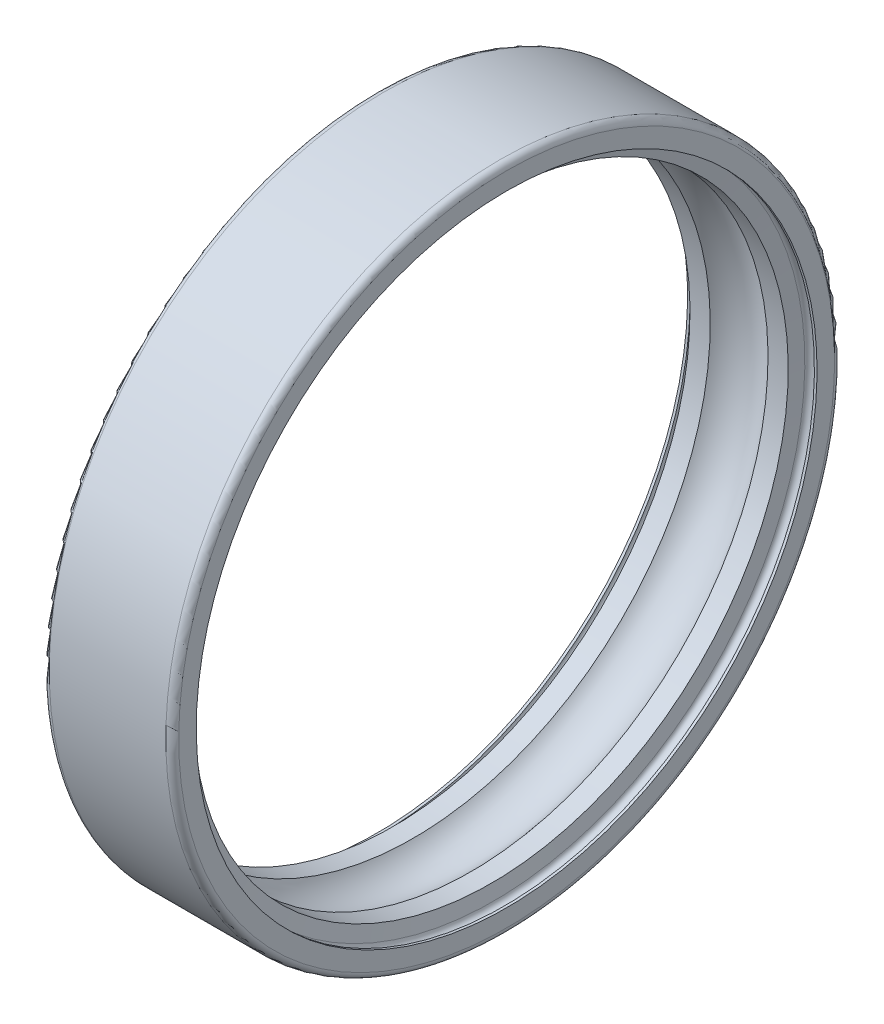
ISO-10303-21;
HEADER;
FILE_DESCRIPTION(('STEP AP214'),'2;1');
FILE_NAME('part.step','',(''),(''),'','','');
FILE_SCHEMA(('AUTOMOTIVE_DESIGN { 1 0 10303 214 1 1 1 1 }'));
ENDSEC;
DATA;
#1=APPLICATION_CONTEXT('core data for automotive mechanical design processes');
#2=APPLICATION_PROTOCOL_DEFINITION('international standard','automotive_design',2000,#1);
#3=PRODUCT_CONTEXT('',#1,'mechanical');
#4=PRODUCT('Part','Part','',(#3));
#5=PRODUCT_RELATED_PRODUCT_CATEGORY('part','',(#4));
#6=PRODUCT_DEFINITION_FORMATION('','',#4);
#7=PRODUCT_DEFINITION_CONTEXT('part definition',#1,'design');
#8=PRODUCT_DEFINITION('design','',#6,#7);
#9=PRODUCT_DEFINITION_SHAPE('','',#8);
#10=(LENGTH_UNIT() NAMED_UNIT(*) SI_UNIT(.MILLI.,.METRE.));
#11=(NAMED_UNIT(*) PLANE_ANGLE_UNIT() SI_UNIT($,.RADIAN.));
#12=(NAMED_UNIT(*) SI_UNIT($,.STERADIAN.) SOLID_ANGLE_UNIT());
#13=UNCERTAINTY_MEASURE_WITH_UNIT(LENGTH_MEASURE(1.E-05),#10,'distance_accuracy_value','');
#14=(GEOMETRIC_REPRESENTATION_CONTEXT(3) GLOBAL_UNCERTAINTY_ASSIGNED_CONTEXT((#13)) GLOBAL_UNIT_ASSIGNED_CONTEXT((#10,
#11,#12)) REPRESENTATION_CONTEXT('',''));
#15=CARTESIAN_POINT('',(0.,0.,0.));
#16=DIRECTION('',(0.,0.,1.));
#17=DIRECTION('',(1.,0.,0.));
#18=AXIS2_PLACEMENT_3D('',#15,#16,#17);
#19=CARTESIAN_POINT('',(11.265,0.,0.));
#20=DIRECTION('',(1.,0.,0.));
#21=DIRECTION('',(0.,0.,-1.));
#22=AXIS2_PLACEMENT_3D('',#19,#20,#21);
#23=TOROIDAL_SURFACE('',#22,28.775,0.49);
#24=CARTESIAN_POINT('',(11.755,0.,0.));
#25=DIRECTION('',(1.,0.,0.));
#26=DIRECTION('',(0.,1.,0.));
#27=AXIS2_PLACEMENT_3D('',#24,#25,#26);
#28=CIRCLE('',#27,28.775);
#29=CARTESIAN_POINT('',(11.755,28.775,0.));
#30=VERTEX_POINT('',#29);
#31=EDGE_CURVE('E11',#30,#30,#28,.T.);
#32=ORIENTED_EDGE('',*,*,#31,.T.);
#33=EDGE_LOOP('',(#32));
#34=FACE_BOUND('',#33,.T.);
#35=CARTESIAN_POINT('',(10.782444201024,0.,0.));
#36=DIRECTION('',(1.,0.,0.));
#37=DIRECTION('',(0.,1.,0.));
#38=AXIS2_PLACEMENT_3D('',#35,#36,#37);
#39=CIRCLE('',#38,28.8600876070568);
#40=CARTESIAN_POINT('',(10.782444201024,28.8600876070568,0.));
#41=VERTEX_POINT('',#40);
#42=EDGE_CURVE('E90',#41,#41,#39,.T.);
#43=ORIENTED_EDGE('',*,*,#42,.F.);
#44=EDGE_LOOP('',(#43));
#45=FACE_BOUND('',#44,.T.);
#46=ADVANCED_FACE('F16',(#34,#45),#23,.F.);
#47=CARTESIAN_POINT('',(11.8775,0.,0.));
#48=DIRECTION('',(-1.,0.,0.));
#49=DIRECTION('',(0.,1.,0.));
#50=AXIS2_PLACEMENT_3D('',#47,#48,#49);
#51=CYLINDRICAL_SURFACE('',#50,28.775);
#52=CARTESIAN_POINT('',(12.,0.,0.));
#53=DIRECTION('',(1.,0.,0.));
#54=DIRECTION('',(0.,1.,0.));
#55=AXIS2_PLACEMENT_3D('',#52,#53,#54);
#56=CIRCLE('',#55,28.775);
#57=CARTESIAN_POINT('',(12.,28.775,0.));
#58=VERTEX_POINT('',#57);
#59=EDGE_CURVE('E26',#58,#58,#56,.T.);
#60=ORIENTED_EDGE('',*,*,#59,.T.);
#61=EDGE_LOOP('',(#60));
#62=FACE_BOUND('',#61,.T.);
#63=ORIENTED_EDGE('',*,*,#31,.F.);
#64=EDGE_LOOP('',(#63));
#65=FACE_BOUND('',#64,.T.);
#66=ADVANCED_FACE('F123',(#62,#65),#51,.F.);
#67=CARTESIAN_POINT('',(12.,29.5875,0.));
#68=DIRECTION('',(1.,0.,0.));
#69=DIRECTION('',(0.,1.,0.));
#70=AXIS2_PLACEMENT_3D('',#67,#68,#69);
#71=PLANE('',#70);
#72=CARTESIAN_POINT('',(12.,0.,0.));
#73=DIRECTION('',(1.,0.,0.));
#74=DIRECTION('',(0.,1.,0.));
#75=AXIS2_PLACEMENT_3D('',#72,#73,#74);
#76=CIRCLE('',#75,30.4);
#77=CARTESIAN_POINT('',(12.,30.4,0.));
#78=VERTEX_POINT('',#77);
#79=EDGE_CURVE('E77',#78,#78,#76,.T.);
#80=ORIENTED_EDGE('',*,*,#79,.T.);
#81=EDGE_LOOP('',(#80));
#82=FACE_BOUND('',#81,.T.);
#83=ORIENTED_EDGE('',*,*,#59,.F.);
#84=EDGE_LOOP('',(#83));
#85=FACE_BOUND('',#84,.T.);
#86=ADVANCED_FACE('F128',(#82,#85),#71,.T.);
#87=CARTESIAN_POINT('',(11.4,0.,0.));
#88=DIRECTION('',(1.,0.,0.));
#89=DIRECTION('',(0.,0.,-1.));
#90=AXIS2_PLACEMENT_3D('',#87,#88,#89);
#91=TOROIDAL_SURFACE('',#90,30.4,0.6);
#92=CARTESIAN_POINT('',(11.4,0.,0.));
#93=DIRECTION('',(1.,0.,0.));
#94=DIRECTION('',(0.,1.,0.));
#95=AXIS2_PLACEMENT_3D('',#92,#93,#94);
#96=CIRCLE('',#95,31.);
#97=CARTESIAN_POINT('',(11.4,31.,0.));
#98=VERTEX_POINT('',#97);
#99=EDGE_CURVE('E73',#98,#98,#96,.T.);
#100=ORIENTED_EDGE('',*,*,#99,.T.);
#101=EDGE_LOOP('',(#100));
#102=FACE_BOUND('',#101,.T.);
#103=ORIENTED_EDGE('',*,*,#79,.F.);
#104=EDGE_LOOP('',(#103));
#105=FACE_BOUND('',#104,.T.);
#106=ADVANCED_FACE('F74',(#102,#105),#91,.T.);
#107=CARTESIAN_POINT('',(6.,0.,0.));
#108=DIRECTION('',(-1.,0.,0.));
#109=DIRECTION('',(0.,1.,0.));
#110=AXIS2_PLACEMENT_3D('',#107,#108,#109);
#111=CYLINDRICAL_SURFACE('',#110,31.);
#112=CARTESIAN_POINT('',(0.6,0.,0.));
#113=DIRECTION('',(1.,0.,0.));
#114=DIRECTION('',(0.,1.,0.));
#115=AXIS2_PLACEMENT_3D('',#112,#113,#114);
#116=CIRCLE('',#115,31.);
#117=CARTESIAN_POINT('',(0.6,31.,0.));
#118=VERTEX_POINT('',#117);
#119=EDGE_CURVE('E78',#118,#118,#116,.T.);
#120=ORIENTED_EDGE('',*,*,#119,.T.);
#121=EDGE_LOOP('',(#120));
#122=FACE_BOUND('',#121,.T.);
#123=ORIENTED_EDGE('',*,*,#99,.F.);
#124=EDGE_LOOP('',(#123));
#125=FACE_BOUND('',#124,.T.);
#126=ADVANCED_FACE('F134',(#122,#125),#111,.T.);
#127=CARTESIAN_POINT('',(0.6,0.,0.));
#128=DIRECTION('',(1.,0.,0.));
#129=DIRECTION('',(0.,0.,-1.));
#130=AXIS2_PLACEMENT_3D('',#127,#128,#129);
#131=TOROIDAL_SURFACE('',#130,30.4,0.6);
#132=CARTESIAN_POINT('',(0.,0.,0.));
#133=DIRECTION('',(1.,0.,0.));
#134=DIRECTION('',(0.,1.,0.));
#135=AXIS2_PLACEMENT_3D('',#132,#133,#134);
#136=CIRCLE('',#135,30.4);
#137=CARTESIAN_POINT('',(0.,30.4,0.));
#138=VERTEX_POINT('',#137);
#139=EDGE_CURVE('E81',#138,#138,#136,.T.);
#140=ORIENTED_EDGE('',*,*,#139,.T.);
#141=EDGE_LOOP('',(#140));
#142=FACE_BOUND('',#141,.T.);
#143=ORIENTED_EDGE('',*,*,#119,.F.);
#144=EDGE_LOOP('',(#143));
#145=FACE_BOUND('',#144,.T.);
#146=ADVANCED_FACE('F204',(#142,#145),#131,.T.);
#147=CARTESIAN_POINT('',(0.,29.5875,0.));
#148=DIRECTION('',(-1.,0.,0.));
#149=DIRECTION('',(0.,-1.,0.));
#150=AXIS2_PLACEMENT_3D('',#147,#148,#149);
#151=PLANE('',#150);
#152=CARTESIAN_POINT('',(0.,0.,0.));
#153=DIRECTION('',(1.,0.,0.));
#154=DIRECTION('',(0.,1.,0.));
#155=AXIS2_PLACEMENT_3D('',#152,#153,#154);
#156=CIRCLE('',#155,28.775);
#157=CARTESIAN_POINT('',(0.,28.775,0.));
#158=VERTEX_POINT('',#157);
#159=EDGE_CURVE('E52',#158,#158,#156,.T.);
#160=ORIENTED_EDGE('',*,*,#159,.T.);
#161=EDGE_LOOP('',(#160));
#162=FACE_BOUND('',#161,.T.);
#163=ORIENTED_EDGE('',*,*,#139,.F.);
#164=EDGE_LOOP('',(#163));
#165=FACE_BOUND('',#164,.T.);
#166=ADVANCED_FACE('F18',(#162,#165),#151,.T.);
#167=CARTESIAN_POINT('',(0.122499999999999,0.,0.));
#168=DIRECTION('',(-1.,0.,0.));
#169=DIRECTION('',(0.,1.,0.));
#170=AXIS2_PLACEMENT_3D('',#167,#168,#169);
#171=CYLINDRICAL_SURFACE('',#170,28.775);
#172=CARTESIAN_POINT('',(0.245,0.,0.));
#173=DIRECTION('',(1.,0.,0.));
#174=DIRECTION('',(0.,1.,0.));
#175=AXIS2_PLACEMENT_3D('',#172,#173,#174);
#176=CIRCLE('',#175,28.775);
#177=CARTESIAN_POINT('',(0.245,28.775,0.));
#178=VERTEX_POINT('',#177);
#179=EDGE_CURVE('E60',#178,#178,#176,.T.);
#180=ORIENTED_EDGE('',*,*,#179,.T.);
#181=EDGE_LOOP('',(#180));
#182=FACE_BOUND('',#181,.T.);
#183=ORIENTED_EDGE('',*,*,#159,.F.);
#184=EDGE_LOOP('',(#183));
#185=FACE_BOUND('',#184,.T.);
#186=ADVANCED_FACE('F118',(#182,#185),#171,.F.);
#187=CARTESIAN_POINT('',(0.735,0.,0.));
#188=DIRECTION('',(1.,0.,0.));
#189=DIRECTION('',(0.,0.,-1.));
#190=AXIS2_PLACEMENT_3D('',#187,#188,#189);
#191=TOROIDAL_SURFACE('',#190,28.775,0.49);
#192=CARTESIAN_POINT('',(1.21755579897598,0.,0.));
#193=DIRECTION('',(1.,0.,0.));
#194=DIRECTION('',(0.,1.,0.));
#195=AXIS2_PLACEMENT_3D('',#192,#193,#194);
#196=CIRCLE('',#195,28.8600876070568);
#197=CARTESIAN_POINT('',(1.21755579897598,28.8600876070568,0.));
#198=VERTEX_POINT('',#197);
#199=EDGE_CURVE('E87',#198,#198,#196,.T.);
#200=ORIENTED_EDGE('',*,*,#199,.T.);
#201=EDGE_LOOP('',(#200));
#202=FACE_BOUND('',#201,.T.);
#203=ORIENTED_EDGE('',*,*,#179,.F.);
#204=EDGE_LOOP('',(#203));
#205=FACE_BOUND('',#204,.T.);
#206=ADVANCED_FACE('F102',(#202,#205),#191,.F.);
#207=CARTESIAN_POINT('',(1.33305769508393,0.,0.));
#208=DIRECTION('',(-1.,0.,0.));
#209=DIRECTION('',(0.,1.,0.));
#210=AXIS2_PLACEMENT_3D('',#207,#208,#209);
#211=CONICAL_SURFACE('',#210,28.2050438035284,1.39626340159546);
#212=CARTESIAN_POINT('',(1.44855959119188,0.,0.));
#213=DIRECTION('',(1.,0.,0.));
#214=DIRECTION('',(0.,1.,0.));
#215=AXIS2_PLACEMENT_3D('',#212,#213,#214);
#216=CIRCLE('',#215,27.55);
#217=CARTESIAN_POINT('',(1.44855959119188,27.55,0.));
#218=VERTEX_POINT('',#217);
#219=EDGE_CURVE('E93',#218,#218,#216,.T.);
#220=ORIENTED_EDGE('',*,*,#219,.T.);
#221=EDGE_LOOP('',(#220));
#222=FACE_BOUND('',#221,.T.);
#223=ORIENTED_EDGE('',*,*,#199,.F.);
#224=EDGE_LOOP('',(#223));
#225=FACE_BOUND('',#224,.T.);
#226=ADVANCED_FACE('F105',(#222,#225),#211,.F.);
#227=CARTESIAN_POINT('',(2.384690096285,0.,0.));
#228=DIRECTION('',(-1.,0.,0.));
#229=DIRECTION('',(0.,1.,0.));
#230=AXIS2_PLACEMENT_3D('',#227,#228,#229);
#231=CYLINDRICAL_SURFACE('',#230,27.55);
#232=CARTESIAN_POINT('',(3.32082060137811,0.,0.));
#233=DIRECTION('',(1.,0.,0.));
#234=DIRECTION('',(0.,1.,0.));
#235=AXIS2_PLACEMENT_3D('',#232,#233,#234);
#236=CIRCLE('',#235,27.55);
#237=CARTESIAN_POINT('',(3.32082060137811,27.55,0.));
#238=VERTEX_POINT('',#237);
#239=EDGE_CURVE('E95',#238,#238,#236,.T.);
#240=ORIENTED_EDGE('',*,*,#239,.T.);
#241=EDGE_LOOP('',(#240));
#242=FACE_BOUND('',#241,.T.);
#243=ORIENTED_EDGE('',*,*,#219,.F.);
#244=EDGE_LOOP('',(#243));
#245=FACE_BOUND('',#244,.T.);
#246=ADVANCED_FACE('F107',(#242,#245),#231,.F.);
#247=CARTESIAN_POINT('',(6.,0.,0.));
#248=DIRECTION('',(1.,0.,0.));
#249=DIRECTION('',(0.,0.,-1.));
#250=AXIS2_PLACEMENT_3D('',#247,#248,#249);
#251=TOROIDAL_SURFACE('',#250,25.5,3.3735);
#252=CARTESIAN_POINT('',(8.67917939862189,0.,0.));
#253=DIRECTION('',(1.,0.,0.));
#254=DIRECTION('',(0.,1.,0.));
#255=AXIS2_PLACEMENT_3D('',#252,#253,#254);
#256=CIRCLE('',#255,27.55);
#257=CARTESIAN_POINT('',(8.67917939862189,27.55,0.));
#258=VERTEX_POINT('',#257);
#259=EDGE_CURVE('E91',#258,#258,#256,.T.);
#260=ORIENTED_EDGE('',*,*,#259,.T.);
#261=EDGE_LOOP('',(#260));
#262=FACE_BOUND('',#261,.T.);
#263=ORIENTED_EDGE('',*,*,#239,.F.);
#264=EDGE_LOOP('',(#263));
#265=FACE_BOUND('',#264,.T.);
#266=ADVANCED_FACE('F115',(#262,#265),#251,.F.);
#267=CARTESIAN_POINT('',(9.615309903715,0.,0.));
#268=DIRECTION('',(-1.,0.,0.));
#269=DIRECTION('',(0.,1.,0.));
#270=AXIS2_PLACEMENT_3D('',#267,#268,#269);
#271=CYLINDRICAL_SURFACE('',#270,27.55);
#272=CARTESIAN_POINT('',(10.5514404088081,0.,0.));
#273=DIRECTION('',(1.,0.,0.));
#274=DIRECTION('',(0.,1.,0.));
#275=AXIS2_PLACEMENT_3D('',#272,#273,#274);
#276=CIRCLE('',#275,27.55);
#277=CARTESIAN_POINT('',(10.5514404088081,27.55,0.));
#278=VERTEX_POINT('',#277);
#279=EDGE_CURVE('E20',#278,#278,#276,.T.);
#280=ORIENTED_EDGE('',*,*,#279,.T.);
#281=EDGE_LOOP('',(#280));
#282=FACE_BOUND('',#281,.T.);
#283=ORIENTED_EDGE('',*,*,#259,.F.);
#284=EDGE_LOOP('',(#283));
#285=FACE_BOUND('',#284,.T.);
#286=ADVANCED_FACE('F136',(#282,#285),#271,.F.);
#287=CARTESIAN_POINT('',(10.6669423049161,0.,0.));
#288=DIRECTION('',(1.,0.,0.));
#289=DIRECTION('',(0.,1.,0.));
#290=AXIS2_PLACEMENT_3D('',#287,#288,#289);
#291=CONICAL_SURFACE('',#290,28.2050438035284,1.39626340159546);
#292=ORIENTED_EDGE('',*,*,#42,.T.);
#293=EDGE_LOOP('',(#292));
#294=FACE_BOUND('',#293,.T.);
#295=ORIENTED_EDGE('',*,*,#279,.F.);
#296=EDGE_LOOP('',(#295));
#297=FACE_BOUND('',#296,.T.);
#298=ADVANCED_FACE('F138',(#294,#297),#291,.F.);
#299=CLOSED_SHELL('',(#46,#66,#86,#106,#126,#146,#166,#186,#206,#226,#246,#266,#286,#298));
#300=MANIFOLD_SOLID_BREP('B1',#299);
#301=ADVANCED_BREP_SHAPE_REPRESENTATION('',(#18,#300),#14);
#302=SHAPE_DEFINITION_REPRESENTATION(#9,#301);
ENDSEC;
END-ISO-10303-21;
